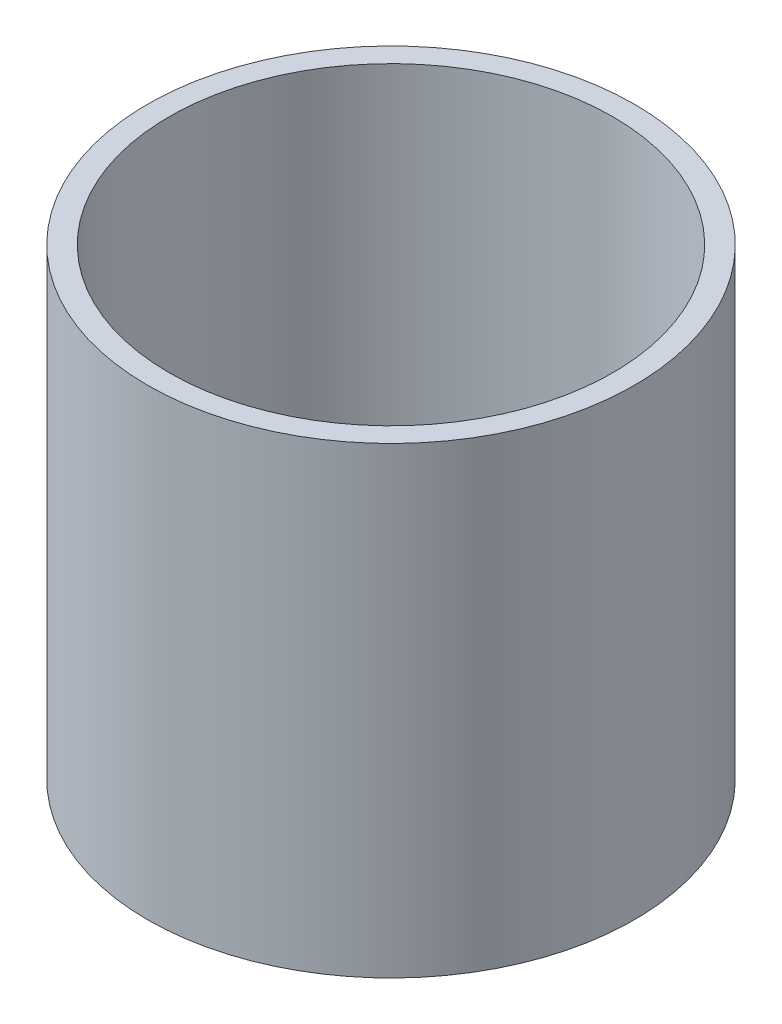
ISO-10303-21;
HEADER;
FILE_DESCRIPTION(('STEP AP214'),'2;1');
FILE_NAME('part.step','',(''),(''),'','','');
FILE_SCHEMA(('AUTOMOTIVE_DESIGN { 1 0 10303 214 1 1 1 1 }'));
ENDSEC;
DATA;
#1=APPLICATION_CONTEXT('core data for automotive mechanical design processes');
#2=APPLICATION_PROTOCOL_DEFINITION('international standard','automotive_design',2000,#1);
#3=PRODUCT_CONTEXT('',#1,'mechanical');
#4=PRODUCT('Part','Part','',(#3));
#5=PRODUCT_RELATED_PRODUCT_CATEGORY('part','',(#4));
#6=PRODUCT_DEFINITION_FORMATION('','',#4);
#7=PRODUCT_DEFINITION_CONTEXT('part definition',#1,'design');
#8=PRODUCT_DEFINITION('design','',#6,#7);
#9=PRODUCT_DEFINITION_SHAPE('','',#8);
#10=(LENGTH_UNIT() NAMED_UNIT(*) SI_UNIT(.MILLI.,.METRE.));
#11=(NAMED_UNIT(*) PLANE_ANGLE_UNIT() SI_UNIT($,.RADIAN.));
#12=(NAMED_UNIT(*) SI_UNIT($,.STERADIAN.) SOLID_ANGLE_UNIT());
#13=UNCERTAINTY_MEASURE_WITH_UNIT(LENGTH_MEASURE(1.E-05),#10,'distance_accuracy_value','');
#14=(GEOMETRIC_REPRESENTATION_CONTEXT(3) GLOBAL_UNCERTAINTY_ASSIGNED_CONTEXT((#13)) GLOBAL_UNIT_ASSIGNED_CONTEXT((#10,
#11,#12)) REPRESENTATION_CONTEXT('',''));
#15=CARTESIAN_POINT('',(0.,0.,0.));
#16=DIRECTION('',(0.,0.,1.));
#17=DIRECTION('',(1.,0.,0.));
#18=AXIS2_PLACEMENT_3D('',#15,#16,#17);
#19=CARTESIAN_POINT('',(0.,10.,0.));
#20=DIRECTION('',(0.,1.,0.));
#21=DIRECTION('',(0.,0.,1.));
#22=AXIS2_PLACEMENT_3D('',#19,#20,#21);
#23=PLANE('',#22);
#24=CARTESIAN_POINT('',(18.765,10.,0.));
#25=DIRECTION('',(0.,1.,0.));
#26=DIRECTION('',(0.,0.,1.));
#27=AXIS2_PLACEMENT_3D('',#24,#25,#26);
#28=CIRCLE('',#27,4.15);
#29=CARTESIAN_POINT('',(18.765,10.,4.14999999999999));
#30=VERTEX_POINT('',#29);
#31=EDGE_CURVE('E69',#30,#30,#28,.T.);
#32=ORIENTED_EDGE('',*,*,#31,.F.);
#33=EDGE_LOOP('',(#32));
#34=FACE_BOUND('',#33,.T.);
#35=CARTESIAN_POINT('',(-18.765,10.,0.));
#36=DIRECTION('',(0.,1.,0.));
#37=DIRECTION('',(0.,0.,1.));
#38=AXIS2_PLACEMENT_3D('',#35,#36,#37);
#39=CIRCLE('',#38,4.15);
#40=CARTESIAN_POINT('',(-18.765,10.,4.15));
#41=VERTEX_POINT('',#40);
#42=EDGE_CURVE('E63',#41,#41,#39,.T.);
#43=ORIENTED_EDGE('',*,*,#42,.F.);
#44=EDGE_LOOP('',(#43));
#45=FACE_BOUND('',#44,.T.);
#46=CARTESIAN_POINT('',(0.,10.,0.));
#47=DIRECTION('',(0.,1.,0.));
#48=DIRECTION('',(0.,0.,1.));
#49=AXIS2_PLACEMENT_3D('',#46,#47,#48);
#50=CIRCLE('',#49,28.75);
#51=CARTESIAN_POINT('',(0.,10.,28.75));
#52=VERTEX_POINT('',#51);
#53=EDGE_CURVE('E10',#52,#52,#50,.F.);
#54=ORIENTED_EDGE('',*,*,#53,.F.);
#55=EDGE_LOOP('',(#54));
#56=FACE_BOUND('',#55,.T.);
#57=ADVANCED_FACE('F41',(#34,#45,#56),#23,.T.);
#58=CARTESIAN_POINT('',(0.,10.,0.));
#59=DIRECTION('',(0.,-1.,0.));
#60=DIRECTION('',(0.,0.,-1.));
#61=AXIS2_PLACEMENT_3D('',#58,#59,#60);
#62=CYLINDRICAL_SURFACE('',#61,31.55);
#63=CARTESIAN_POINT('',(0.,0.,0.));
#64=DIRECTION('',(0.,1.,0.));
#65=DIRECTION('',(0.,0.,1.));
#66=AXIS2_PLACEMENT_3D('',#63,#64,#65);
#67=CIRCLE('',#66,31.55);
#68=CARTESIAN_POINT('',(0.,0.,31.55));
#69=VERTEX_POINT('',#68);
#70=EDGE_CURVE('E49',#69,#69,#67,.T.);
#71=ORIENTED_EDGE('',*,*,#70,.T.);
#72=EDGE_LOOP('',(#71));
#73=FACE_BOUND('',#72,.T.);
#74=CARTESIAN_POINT('',(0.,60.,0.));
#75=DIRECTION('',(0.,1.,0.));
#76=DIRECTION('',(0.,0.,1.));
#77=AXIS2_PLACEMENT_3D('',#74,#75,#76);
#78=CIRCLE('',#77,31.55);
#79=CARTESIAN_POINT('',(0.,60.,31.55));
#80=VERTEX_POINT('',#79);
#81=EDGE_CURVE('E70',#80,#80,#78,.T.);
#82=ORIENTED_EDGE('',*,*,#81,.F.);
#83=EDGE_LOOP('',(#82));
#84=FACE_BOUND('',#83,.T.);
#85=ADVANCED_FACE('F43',(#73,#84),#62,.T.);
#86=CARTESIAN_POINT('',(0.,0.,0.));
#87=DIRECTION('',(0.,1.,0.));
#88=DIRECTION('',(0.,0.,1.));
#89=AXIS2_PLACEMENT_3D('',#86,#87,#88);
#90=PLANE('',#89);
#91=CARTESIAN_POINT('',(-18.765,0.,0.));
#92=DIRECTION('',(0.,1.,0.));
#93=DIRECTION('',(0.,0.,1.));
#94=AXIS2_PLACEMENT_3D('',#91,#92,#93);
#95=CIRCLE('',#94,4.15);
#96=CARTESIAN_POINT('',(-18.765,0.,4.15));
#97=VERTEX_POINT('',#96);
#98=EDGE_CURVE('E56',#97,#97,#95,.T.);
#99=ORIENTED_EDGE('',*,*,#98,.T.);
#100=EDGE_LOOP('',(#99));
#101=FACE_BOUND('',#100,.T.);
#102=CARTESIAN_POINT('',(18.765,0.,0.));
#103=DIRECTION('',(0.,1.,0.));
#104=DIRECTION('',(0.,0.,1.));
#105=AXIS2_PLACEMENT_3D('',#102,#103,#104);
#106=CIRCLE('',#105,4.15);
#107=CARTESIAN_POINT('',(18.765,0.,4.14999999999999));
#108=VERTEX_POINT('',#107);
#109=EDGE_CURVE('E66',#108,#108,#106,.T.);
#110=ORIENTED_EDGE('',*,*,#109,.T.);
#111=EDGE_LOOP('',(#110));
#112=FACE_BOUND('',#111,.T.);
#113=ORIENTED_EDGE('',*,*,#70,.F.);
#114=EDGE_LOOP('',(#113));
#115=FACE_BOUND('',#114,.T.);
#116=ADVANCED_FACE('F101',(#101,#112,#115),#90,.F.);
#117=CARTESIAN_POINT('',(18.765,0.,0.));
#118=DIRECTION('',(0.,1.,0.));
#119=DIRECTION('',(0.,0.,1.));
#120=AXIS2_PLACEMENT_3D('',#117,#118,#119);
#121=CYLINDRICAL_SURFACE('',#120,4.15);
#122=ORIENTED_EDGE('',*,*,#109,.F.);
#123=EDGE_LOOP('',(#122));
#124=FACE_BOUND('',#123,.T.);
#125=ORIENTED_EDGE('',*,*,#31,.T.);
#126=EDGE_LOOP('',(#125));
#127=FACE_BOUND('',#126,.T.);
#128=ADVANCED_FACE('F93',(#124,#127),#121,.F.);
#129=CARTESIAN_POINT('',(-18.765,0.,0.));
#130=DIRECTION('',(0.,1.,0.));
#131=DIRECTION('',(0.,0.,1.));
#132=AXIS2_PLACEMENT_3D('',#129,#130,#131);
#133=CYLINDRICAL_SURFACE('',#132,4.15);
#134=ORIENTED_EDGE('',*,*,#98,.F.);
#135=EDGE_LOOP('',(#134));
#136=FACE_BOUND('',#135,.T.);
#137=ORIENTED_EDGE('',*,*,#42,.T.);
#138=EDGE_LOOP('',(#137));
#139=FACE_BOUND('',#138,.T.);
#140=ADVANCED_FACE('F86',(#136,#139),#133,.F.);
#141=CARTESIAN_POINT('',(0.,60.,0.));
#142=DIRECTION('',(0.,1.,0.));
#143=DIRECTION('',(0.,0.,1.));
#144=AXIS2_PLACEMENT_3D('',#141,#142,#143);
#145=PLANE('',#144);
#146=ORIENTED_EDGE('',*,*,#81,.T.);
#147=EDGE_LOOP('',(#146));
#148=FACE_BOUND('',#147,.T.);
#149=CARTESIAN_POINT('',(0.,60.,0.));
#150=DIRECTION('',(0.,1.,0.));
#151=DIRECTION('',(0.,0.,1.));
#152=AXIS2_PLACEMENT_3D('',#149,#150,#151);
#153=CIRCLE('',#152,28.75);
#154=CARTESIAN_POINT('',(0.,60.,28.75));
#155=VERTEX_POINT('',#154);
#156=EDGE_CURVE('E78',#155,#155,#153,.T.);
#157=ORIENTED_EDGE('',*,*,#156,.F.);
#158=EDGE_LOOP('',(#157));
#159=FACE_BOUND('',#158,.T.);
#160=ADVANCED_FACE('F84',(#148,#159),#145,.T.);
#161=CARTESIAN_POINT('',(0.,60.,0.));
#162=DIRECTION('',(0.,-1.,0.));
#163=DIRECTION('',(0.,0.,-1.));
#164=AXIS2_PLACEMENT_3D('',#161,#162,#163);
#165=CYLINDRICAL_SURFACE('',#164,28.75);
#166=ORIENTED_EDGE('',*,*,#156,.T.);
#167=EDGE_LOOP('',(#166));
#168=FACE_BOUND('',#167,.T.);
#169=ORIENTED_EDGE('',*,*,#53,.T.);
#170=EDGE_LOOP('',(#169));
#171=FACE_BOUND('',#170,.T.);
#172=ADVANCED_FACE('F82',(#168,#171),#165,.F.);
#173=CLOSED_SHELL('',(#57,#85,#116,#128,#140,#160,#172));
#174=MANIFOLD_SOLID_BREP('B2',#173);
#175=ADVANCED_BREP_SHAPE_REPRESENTATION('',(#18,#174),#14);
#176=SHAPE_DEFINITION_REPRESENTATION(#9,#175);
ENDSEC;
END-ISO-10303-21;
